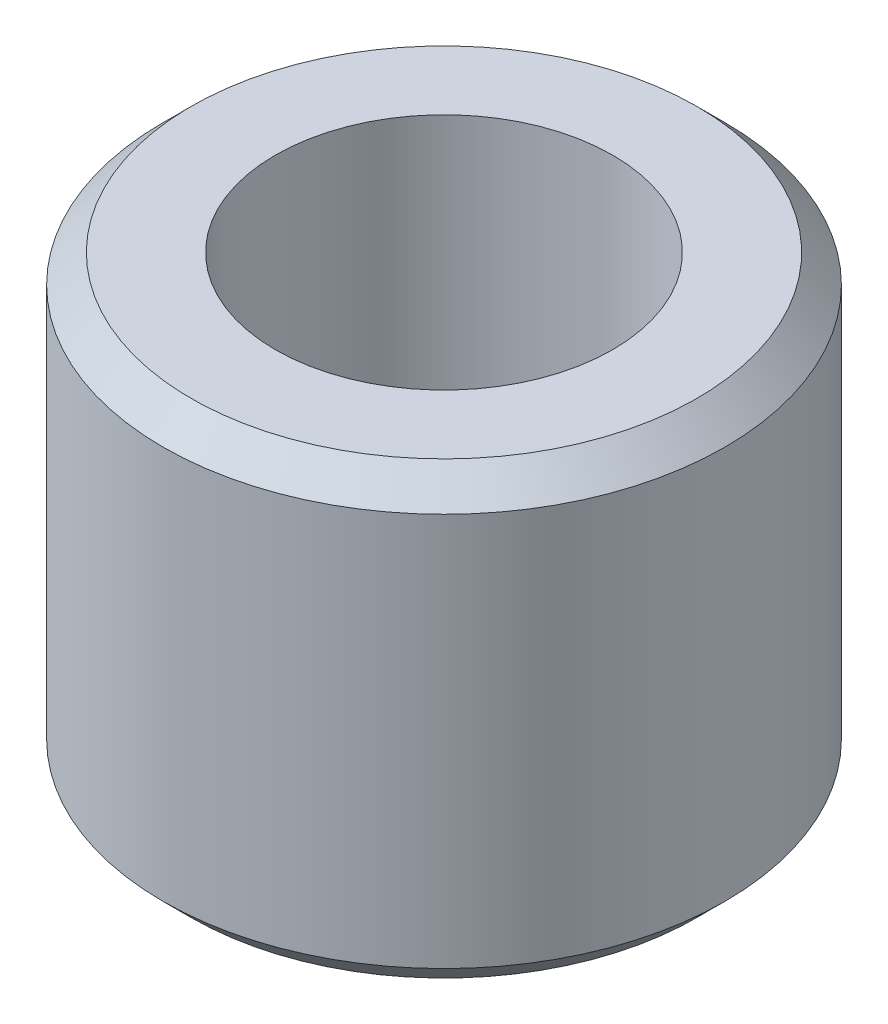
ISO-10303-21;
HEADER;
FILE_DESCRIPTION(('STEP AP214'),'2;1');
FILE_NAME('part.step','',(''),(''),'','','');
FILE_SCHEMA(('AUTOMOTIVE_DESIGN { 1 0 10303 214 1 1 1 1 }'));
ENDSEC;
DATA;
#1=APPLICATION_CONTEXT('core data for automotive mechanical design processes');
#2=APPLICATION_PROTOCOL_DEFINITION('international standard','automotive_design',2000,#1);
#3=PRODUCT_CONTEXT('',#1,'mechanical');
#4=PRODUCT('Part','Part','',(#3));
#5=PRODUCT_RELATED_PRODUCT_CATEGORY('part','',(#4));
#6=PRODUCT_DEFINITION_FORMATION('','',#4);
#7=PRODUCT_DEFINITION_CONTEXT('part definition',#1,'design');
#8=PRODUCT_DEFINITION('design','',#6,#7);
#9=PRODUCT_DEFINITION_SHAPE('','',#8);
#10=(LENGTH_UNIT() NAMED_UNIT(*) SI_UNIT(.MILLI.,.METRE.));
#11=(NAMED_UNIT(*) PLANE_ANGLE_UNIT() SI_UNIT($,.RADIAN.));
#12=(NAMED_UNIT(*) SI_UNIT($,.STERADIAN.) SOLID_ANGLE_UNIT());
#13=UNCERTAINTY_MEASURE_WITH_UNIT(LENGTH_MEASURE(1.E-05),#10,'distance_accuracy_value','');
#14=(GEOMETRIC_REPRESENTATION_CONTEXT(3) GLOBAL_UNCERTAINTY_ASSIGNED_CONTEXT((#13)) GLOBAL_UNIT_ASSIGNED_CONTEXT((#10,
#11,#12)) REPRESENTATION_CONTEXT('',''));
#15=CARTESIAN_POINT('',(0.,0.,0.));
#16=DIRECTION('',(0.,0.,1.));
#17=DIRECTION('',(1.,0.,0.));
#18=AXIS2_PLACEMENT_3D('',#15,#16,#17);
#19=CARTESIAN_POINT('',(-9.,-16.,9.));
#20=DIRECTION('',(0.,-1.,0.));
#21=DIRECTION('',(0.,0.,-1.));
#22=AXIS2_PLACEMENT_3D('',#19,#20,#21);
#23=PLANE('',#22);
#24=CARTESIAN_POINT('',(0.,-16.,0.));
#25=DIRECTION('',(0.,1.,0.));
#26=DIRECTION('',(0.,0.,1.));
#27=AXIS2_PLACEMENT_3D('',#24,#25,#26);
#28=CIRCLE('',#27,2.5);
#29=CARTESIAN_POINT('',(0.,-16.,2.5));
#30=VERTEX_POINT('',#29);
#31=EDGE_CURVE('E48',#30,#30,#28,.F.);
#32=ORIENTED_EDGE('',*,*,#31,.F.);
#33=EDGE_LOOP('',(#32));
#34=FACE_BOUND('',#33,.T.);
#35=CARTESIAN_POINT('',(0.,-16.,0.));
#36=DIRECTION('',(0.,1.,0.));
#37=DIRECTION('',(0.,0.,1.));
#38=AXIS2_PLACEMENT_3D('',#35,#36,#37);
#39=CIRCLE('',#38,9.);
#40=CARTESIAN_POINT('',(0.,-16.,9.));
#41=VERTEX_POINT('',#40);
#42=EDGE_CURVE('E51',#41,#41,#39,.F.);
#43=ORIENTED_EDGE('',*,*,#42,.T.);
#44=EDGE_LOOP('',(#43));
#45=FACE_BOUND('',#44,.T.);
#46=ADVANCED_FACE('F14',(#34,#45),#23,.T.);
#47=CARTESIAN_POINT('',(0.,-16.,0.));
#48=DIRECTION('',(0.,1.,0.));
#49=DIRECTION('',(0.,0.,1.));
#50=AXIS2_PLACEMENT_3D('',#47,#48,#49);
#51=CONICAL_SURFACE('',#50,9.,0.785398163397447);
#52=ORIENTED_EDGE('',*,*,#42,.F.);
#53=EDGE_LOOP('',(#52));
#54=FACE_BOUND('',#53,.T.);
#55=CARTESIAN_POINT('',(0.,-15.,0.));
#56=DIRECTION('',(0.,1.,0.));
#57=DIRECTION('',(0.,0.,1.));
#58=AXIS2_PLACEMENT_3D('',#55,#56,#57);
#59=CIRCLE('',#58,10.);
#60=CARTESIAN_POINT('',(0.,-15.,10.));
#61=VERTEX_POINT('',#60);
#62=EDGE_CURVE('E45',#61,#61,#59,.F.);
#63=ORIENTED_EDGE('',*,*,#62,.T.);
#64=EDGE_LOOP('',(#63));
#65=FACE_BOUND('',#64,.T.);
#66=ADVANCED_FACE('F57',(#54,#65),#51,.T.);
#67=CARTESIAN_POINT('',(0.,-16.,0.));
#68=DIRECTION('',(0.,1.,0.));
#69=DIRECTION('',(0.,0.,1.));
#70=AXIS2_PLACEMENT_3D('',#67,#68,#69);
#71=CYLINDRICAL_SURFACE('',#70,2.5);
#72=CARTESIAN_POINT('',(0.,-14.,0.));
#73=DIRECTION('',(0.,1.,0.));
#74=DIRECTION('',(0.,0.,1.));
#75=AXIS2_PLACEMENT_3D('',#72,#73,#74);
#76=CIRCLE('',#75,2.5);
#77=CARTESIAN_POINT('',(0.,-14.,2.5));
#78=VERTEX_POINT('',#77);
#79=EDGE_CURVE('E42',#78,#78,#76,.T.);
#80=ORIENTED_EDGE('',*,*,#79,.T.);
#81=EDGE_LOOP('',(#80));
#82=FACE_BOUND('',#81,.T.);
#83=ORIENTED_EDGE('',*,*,#31,.T.);
#84=EDGE_LOOP('',(#83));
#85=FACE_BOUND('',#84,.T.);
#86=ADVANCED_FACE('F60',(#82,#85),#71,.F.);
#87=CARTESIAN_POINT('',(0.,-15.,0.));
#88=DIRECTION('',(0.,1.,0.));
#89=DIRECTION('',(-1.,0.,0.));
#90=AXIS2_PLACEMENT_3D('',#87,#88,#89);
#91=CYLINDRICAL_SURFACE('',#90,10.);
#92=ORIENTED_EDGE('',*,*,#62,.F.);
#93=EDGE_LOOP('',(#92));
#94=FACE_BOUND('',#93,.T.);
#95=CARTESIAN_POINT('',(0.,-1.,0.));
#96=DIRECTION('',(0.,1.,0.));
#97=DIRECTION('',(0.,0.,1.));
#98=AXIS2_PLACEMENT_3D('',#95,#96,#97);
#99=CIRCLE('',#98,10.);
#100=CARTESIAN_POINT('',(0.,-1.,10.));
#101=VERTEX_POINT('',#100);
#102=EDGE_CURVE('E39',#101,#101,#99,.F.);
#103=ORIENTED_EDGE('',*,*,#102,.T.);
#104=EDGE_LOOP('',(#103));
#105=FACE_BOUND('',#104,.T.);
#106=ADVANCED_FACE('F71',(#94,#105),#91,.T.);
#107=CARTESIAN_POINT('',(-6.,-14.,6.));
#108=DIRECTION('',(0.,-1.,0.));
#109=DIRECTION('',(0.,0.,-1.));
#110=AXIS2_PLACEMENT_3D('',#107,#108,#109);
#111=PLANE('',#110);
#112=ORIENTED_EDGE('',*,*,#79,.F.);
#113=EDGE_LOOP('',(#112));
#114=FACE_BOUND('',#113,.T.);
#115=CARTESIAN_POINT('',(0.,-14.,0.));
#116=DIRECTION('',(0.,1.,0.));
#117=DIRECTION('',(-1.,0.,0.));
#118=AXIS2_PLACEMENT_3D('',#115,#116,#117);
#119=CIRCLE('',#118,6.);
#120=CARTESIAN_POINT('',(-6.,-14.,0.));
#121=VERTEX_POINT('',#120);
#122=EDGE_CURVE('E27',#121,#121,#119,.F.);
#123=ORIENTED_EDGE('',*,*,#122,.F.);
#124=EDGE_LOOP('',(#123));
#125=FACE_BOUND('',#124,.T.);
#126=ADVANCED_FACE('F77',(#114,#125),#111,.F.);
#127=CARTESIAN_POINT('',(0.,-1.,0.));
#128=DIRECTION('',(0.,-1.,0.));
#129=DIRECTION('',(0.,0.,-1.));
#130=AXIS2_PLACEMENT_3D('',#127,#128,#129);
#131=CONICAL_SURFACE('',#130,10.,0.785398163397448);
#132=ORIENTED_EDGE('',*,*,#102,.F.);
#133=EDGE_LOOP('',(#132));
#134=FACE_BOUND('',#133,.T.);
#135=CARTESIAN_POINT('',(0.,0.,0.));
#136=DIRECTION('',(0.,-1.,0.));
#137=DIRECTION('',(0.,0.,-1.));
#138=AXIS2_PLACEMENT_3D('',#135,#136,#137);
#139=CIRCLE('',#138,9.);
#140=CARTESIAN_POINT('',(0.,0.,-9.));
#141=VERTEX_POINT('',#140);
#142=EDGE_CURVE('E22',#141,#141,#139,.F.);
#143=ORIENTED_EDGE('',*,*,#142,.F.);
#144=EDGE_LOOP('',(#143));
#145=FACE_BOUND('',#144,.T.);
#146=ADVANCED_FACE('F73',(#134,#145),#131,.T.);
#147=CARTESIAN_POINT('',(0.,-14.,0.));
#148=DIRECTION('',(0.,1.,0.));
#149=DIRECTION('',(-1.,0.,0.));
#150=AXIS2_PLACEMENT_3D('',#147,#148,#149);
#151=CYLINDRICAL_SURFACE('',#150,6.);
#152=ORIENTED_EDGE('',*,*,#122,.T.);
#153=EDGE_LOOP('',(#152));
#154=FACE_BOUND('',#153,.T.);
#155=CARTESIAN_POINT('',(0.,0.,0.));
#156=DIRECTION('',(0.,1.,0.));
#157=DIRECTION('',(-1.,0.,0.));
#158=AXIS2_PLACEMENT_3D('',#155,#156,#157);
#159=CIRCLE('',#158,6.);
#160=CARTESIAN_POINT('',(-6.,0.,0.));
#161=VERTEX_POINT('',#160);
#162=EDGE_CURVE('E10',#161,#161,#159,.F.);
#163=ORIENTED_EDGE('',*,*,#162,.F.);
#164=EDGE_LOOP('',(#163));
#165=FACE_BOUND('',#164,.T.);
#166=ADVANCED_FACE('F76',(#154,#165),#151,.F.);
#167=CARTESIAN_POINT('',(-9.,0.,-9.));
#168=DIRECTION('',(0.,1.,0.));
#169=DIRECTION('',(0.,0.,1.));
#170=AXIS2_PLACEMENT_3D('',#167,#168,#169);
#171=PLANE('',#170);
#172=ORIENTED_EDGE('',*,*,#162,.T.);
#173=EDGE_LOOP('',(#172));
#174=FACE_BOUND('',#173,.T.);
#175=ORIENTED_EDGE('',*,*,#142,.T.);
#176=EDGE_LOOP('',(#175));
#177=FACE_BOUND('',#176,.T.);
#178=ADVANCED_FACE('F16',(#174,#177),#171,.T.);
#179=CLOSED_SHELL('',(#46,#66,#86,#106,#126,#146,#166,#178));
#180=MANIFOLD_SOLID_BREP('B1',#179);
#181=ADVANCED_BREP_SHAPE_REPRESENTATION('',(#18,#180),#14);
#182=SHAPE_DEFINITION_REPRESENTATION(#9,#181);
ENDSEC;
END-ISO-10303-21;
